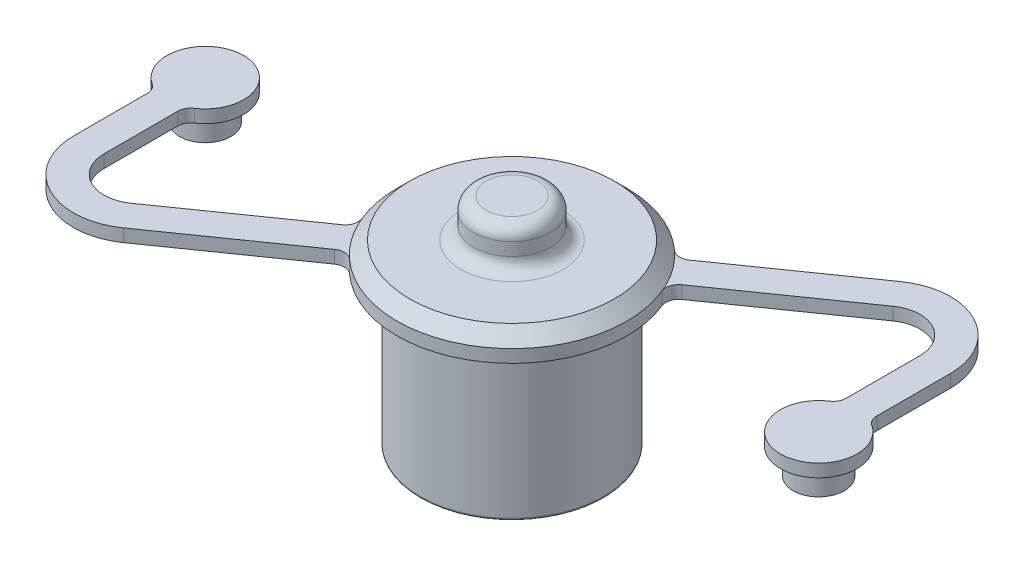
ISO-10303-21;
HEADER;
FILE_DESCRIPTION(('STEP AP214'),'2;1');
FILE_NAME('part.step','',(''),(''),'','','');
FILE_SCHEMA(('AUTOMOTIVE_DESIGN { 1 0 10303 214 1 1 1 1 }'));
ENDSEC;
DATA;
#1=APPLICATION_CONTEXT('core data for automotive mechanical design processes');
#2=APPLICATION_PROTOCOL_DEFINITION('international standard','automotive_design',2000,#1);
#3=PRODUCT_CONTEXT('',#1,'mechanical');
#4=PRODUCT('Part','Part','',(#3));
#5=PRODUCT_RELATED_PRODUCT_CATEGORY('part','',(#4));
#6=PRODUCT_DEFINITION_FORMATION('','',#4);
#7=PRODUCT_DEFINITION_CONTEXT('part definition',#1,'design');
#8=PRODUCT_DEFINITION('design','',#6,#7);
#9=PRODUCT_DEFINITION_SHAPE('','',#8);
#10=(LENGTH_UNIT() NAMED_UNIT(*) SI_UNIT(.MILLI.,.METRE.));
#11=(NAMED_UNIT(*) PLANE_ANGLE_UNIT() SI_UNIT($,.RADIAN.));
#12=(NAMED_UNIT(*) SI_UNIT($,.STERADIAN.) SOLID_ANGLE_UNIT());
#13=UNCERTAINTY_MEASURE_WITH_UNIT(LENGTH_MEASURE(1.E-05),#10,'distance_accuracy_value','');
#14=(GEOMETRIC_REPRESENTATION_CONTEXT(3) GLOBAL_UNCERTAINTY_ASSIGNED_CONTEXT((#13)) GLOBAL_UNIT_ASSIGNED_CONTEXT((#10,
#11,#12)) REPRESENTATION_CONTEXT('',''));
#15=CARTESIAN_POINT('',(0.,0.,0.));
#16=DIRECTION('',(0.,0.,1.));
#17=DIRECTION('',(1.,0.,0.));
#18=AXIS2_PLACEMENT_3D('',#15,#16,#17);
#19=CARTESIAN_POINT('',(0.,1.,0.));
#20=DIRECTION('',(0.,-1.,0.));
#21=DIRECTION('',(0.,0.,-1.));
#22=AXIS2_PLACEMENT_3D('',#19,#20,#21);
#23=CYLINDRICAL_SURFACE('',#22,4.5);
#24=DIRECTION('',(0.,-1.,0.));
#25=VECTOR('',#24,1.);
#26=CARTESIAN_POINT('',(-4.16371288605961,1.,1.70689630688603));
#27=LINE('',#26,#25);
#28=CARTESIAN_POINT('',(-4.16371288605961,0.,1.70689630688603));
#29=VERTEX_POINT('',#28);
#30=CARTESIAN_POINT('',(-4.16371288605961,0.5,1.70689630688603));
#31=VERTEX_POINT('',#30);
#32=EDGE_CURVE('E371',#29,#31,#27,.F.);
#33=ORIENTED_EDGE('',*,*,#32,.T.);
#34=CARTESIAN_POINT('',(0.,0.500000000000002,0.));
#35=DIRECTION('',(0.,1.,0.));
#36=DIRECTION('',(0.,0.,1.));
#37=AXIS2_PLACEMENT_3D('',#34,#35,#36);
#38=CIRCLE('',#37,4.5);
#39=CARTESIAN_POINT('',(3.02803154208453,0.5,-3.32881735457823));
#40=VERTEX_POINT('',#39);
#41=EDGE_CURVE('E395',#31,#40,#38,.F.);
#42=ORIENTED_EDGE('',*,*,#41,.T.);
#43=DIRECTION('',(0.,-1.,0.));
#44=VECTOR('',#43,1.);
#45=CARTESIAN_POINT('',(3.02803154208453,1.,-3.32881735457823));
#46=LINE('',#45,#44);
#47=CARTESIAN_POINT('',(3.02803154208453,0.,-3.32881735457823));
#48=VERTEX_POINT('',#47);
#49=EDGE_CURVE('E327',#40,#48,#46,.T.);
#50=ORIENTED_EDGE('',*,*,#49,.T.);
#51=CARTESIAN_POINT('',(0.,0.,0.));
#52=DIRECTION('',(0.,1.,0.));
#53=DIRECTION('',(0.,0.,1.));
#54=AXIS2_PLACEMENT_3D('',#51,#52,#53);
#55=CIRCLE('',#54,4.5);
#56=EDGE_CURVE('E305',#48,#29,#55,.T.);
#57=ORIENTED_EDGE('',*,*,#56,.T.);
#58=EDGE_LOOP('',(#33,#42,#50,#57));
#59=FACE_BOUND('',#58,.T.);
#60=ADVANCED_FACE('F34',(#59),#23,.T.);
#61=CARTESIAN_POINT('',(-11.4,0.5,4.56052620457425));
#62=DIRECTION('',(-1.,0.,0.));
#63=DIRECTION('',(0.,0.,1.));
#64=AXIS2_PLACEMENT_3D('',#61,#62,#63);
#65=PLANE('',#64);
#66=DIRECTION('',(0.,0.,1.));
#67=VECTOR('',#66,1.);
#68=CARTESIAN_POINT('',(-11.4,0.,4.56052620457425));
#69=LINE('',#68,#67);
#70=CARTESIAN_POINT('',(-11.4,0.,4.56052620457425));
#71=VERTEX_POINT('',#70);
#72=CARTESIAN_POINT('',(-11.4,0.,1.67032930884901));
#73=VERTEX_POINT('',#72);
#74=EDGE_CURVE('E233',#71,#73,#69,.F.);
#75=ORIENTED_EDGE('',*,*,#74,.T.);
#76=DIRECTION('',(0.,1.,0.));
#77=VECTOR('',#76,1.);
#78=CARTESIAN_POINT('',(-11.4,0.5,1.67032930884901));
#79=LINE('',#78,#77);
#80=CARTESIAN_POINT('',(-11.4,0.5,1.67032930884901));
#81=VERTEX_POINT('',#80);
#82=EDGE_CURVE('E361',#73,#81,#79,.T.);
#83=ORIENTED_EDGE('',*,*,#82,.T.);
#84=DIRECTION('',(0.,0.,1.));
#85=VECTOR('',#84,1.);
#86=CARTESIAN_POINT('',(-11.4,0.5,4.56052620457425));
#87=LINE('',#86,#85);
#88=CARTESIAN_POINT('',(-11.4,0.5,4.56052620457425));
#89=VERTEX_POINT('',#88);
#90=EDGE_CURVE('E218',#89,#81,#87,.F.);
#91=ORIENTED_EDGE('',*,*,#90,.F.);
#92=DIRECTION('',(0.,-1.,0.));
#93=VECTOR('',#92,1.);
#94=CARTESIAN_POINT('',(-11.4,0.5,4.56052620457425));
#95=LINE('',#94,#93);
#96=EDGE_CURVE('E232',#89,#71,#95,.T.);
#97=ORIENTED_EDGE('',*,*,#96,.T.);
#98=EDGE_LOOP('',(#75,#83,#91,#97));
#99=FACE_BOUND('',#98,.T.);
#100=ADVANCED_FACE('F424',(#99),#65,.F.);
#101=CARTESIAN_POINT('',(-12.6,0.5,4.56052620457425));
#102=DIRECTION('',(-1.,0.,0.));
#103=DIRECTION('',(0.,0.,1.));
#104=AXIS2_PLACEMENT_3D('',#101,#102,#103);
#105=PLANE('',#104);
#106=DIRECTION('',(0.,0.,1.));
#107=VECTOR('',#106,1.);
#108=CARTESIAN_POINT('',(-12.6,0.5,4.56052620457425));
#109=LINE('',#108,#107);
#110=CARTESIAN_POINT('',(-12.6,0.5,4.56052620457425));
#111=VERTEX_POINT('',#110);
#112=CARTESIAN_POINT('',(-12.6,0.5,1.67032930884901));
#113=VERTEX_POINT('',#112);
#114=EDGE_CURVE('E199',#111,#113,#109,.F.);
#115=ORIENTED_EDGE('',*,*,#114,.T.);
#116=DIRECTION('',(0.,-1.,0.));
#117=VECTOR('',#116,1.);
#118=CARTESIAN_POINT('',(-12.6,0.5,1.67032930884901));
#119=LINE('',#118,#117);
#120=CARTESIAN_POINT('',(-12.6,0.,1.67032930884901));
#121=VERTEX_POINT('',#120);
#122=EDGE_CURVE('E363',#113,#121,#119,.T.);
#123=ORIENTED_EDGE('',*,*,#122,.T.);
#124=DIRECTION('',(0.,0.,1.));
#125=VECTOR('',#124,1.);
#126=CARTESIAN_POINT('',(-12.6,0.,4.56052620457425));
#127=LINE('',#126,#125);
#128=CARTESIAN_POINT('',(-12.6,0.,4.56052620457425));
#129=VERTEX_POINT('',#128);
#130=EDGE_CURVE('E202',#129,#121,#127,.F.);
#131=ORIENTED_EDGE('',*,*,#130,.F.);
#132=DIRECTION('',(0.,-1.,0.));
#133=VECTOR('',#132,1.);
#134=CARTESIAN_POINT('',(-12.6,0.5,4.56052620457425));
#135=LINE('',#134,#133);
#136=EDGE_CURVE('E195',#111,#129,#135,.T.);
#137=ORIENTED_EDGE('',*,*,#136,.F.);
#138=EDGE_LOOP('',(#115,#123,#131,#137));
#139=FACE_BOUND('',#138,.T.);
#140=ADVANCED_FACE('F197',(#139),#105,.T.);
#141=CARTESIAN_POINT('',(11.4,0.5,-4.56052620457425));
#142=DIRECTION('',(1.,0.,0.));
#143=DIRECTION('',(0.,0.,-1.));
#144=AXIS2_PLACEMENT_3D('',#141,#142,#143);
#145=PLANE('',#144);
#146=DIRECTION('',(0.,0.,-1.));
#147=VECTOR('',#146,1.);
#148=CARTESIAN_POINT('',(11.4,0.,-4.56052620457425));
#149=LINE('',#148,#147);
#150=CARTESIAN_POINT('',(11.4,0.,-4.56052620457425));
#151=VERTEX_POINT('',#150);
#152=CARTESIAN_POINT('',(11.4,0.,-1.67032930884901));
#153=VERTEX_POINT('',#152);
#154=EDGE_CURVE('E263',#151,#153,#149,.F.);
#155=ORIENTED_EDGE('',*,*,#154,.T.);
#156=DIRECTION('',(0.,1.,0.));
#157=VECTOR('',#156,1.);
#158=CARTESIAN_POINT('',(11.4,0.5,-1.67032930884901));
#159=LINE('',#158,#157);
#160=CARTESIAN_POINT('',(11.4,0.5,-1.67032930884901));
#161=VERTEX_POINT('',#160);
#162=EDGE_CURVE('E319',#153,#161,#159,.T.);
#163=ORIENTED_EDGE('',*,*,#162,.T.);
#164=DIRECTION('',(0.,0.,-1.));
#165=VECTOR('',#164,1.);
#166=CARTESIAN_POINT('',(11.4,0.5,-4.56052620457425));
#167=LINE('',#166,#165);
#168=CARTESIAN_POINT('',(11.4,0.5,-4.56052620457425));
#169=VERTEX_POINT('',#168);
#170=EDGE_CURVE('E264',#169,#161,#167,.F.);
#171=ORIENTED_EDGE('',*,*,#170,.F.);
#172=DIRECTION('',(0.,-1.,0.));
#173=VECTOR('',#172,1.);
#174=CARTESIAN_POINT('',(11.4,0.5,-4.56052620457425));
#175=LINE('',#174,#173);
#176=EDGE_CURVE('E280',#169,#151,#175,.T.);
#177=ORIENTED_EDGE('',*,*,#176,.T.);
#178=EDGE_LOOP('',(#155,#163,#171,#177));
#179=FACE_BOUND('',#178,.T.);
#180=ADVANCED_FACE('F531',(#179),#145,.F.);
#181=CARTESIAN_POINT('',(12.6,0.5,-4.56052620457425));
#182=DIRECTION('',(1.,0.,0.));
#183=DIRECTION('',(0.,0.,-1.));
#184=AXIS2_PLACEMENT_3D('',#181,#182,#183);
#185=PLANE('',#184);
#186=DIRECTION('',(0.,0.,-1.));
#187=VECTOR('',#186,1.);
#188=CARTESIAN_POINT('',(12.6,0.5,-4.56052620457425));
#189=LINE('',#188,#187);
#190=CARTESIAN_POINT('',(12.6,0.5,-4.56052620457425));
#191=VERTEX_POINT('',#190);
#192=CARTESIAN_POINT('',(12.6,0.5,-1.67032930884901));
#193=VERTEX_POINT('',#192);
#194=EDGE_CURVE('E267',#191,#193,#189,.F.);
#195=ORIENTED_EDGE('',*,*,#194,.T.);
#196=DIRECTION('',(0.,-1.,0.));
#197=VECTOR('',#196,1.);
#198=CARTESIAN_POINT('',(12.6,0.5,-1.67032930884901));
#199=LINE('',#198,#197);
#200=CARTESIAN_POINT('',(12.6,0.,-1.67032930884901));
#201=VERTEX_POINT('',#200);
#202=EDGE_CURVE('E321',#193,#201,#199,.T.);
#203=ORIENTED_EDGE('',*,*,#202,.T.);
#204=DIRECTION('',(0.,0.,-1.));
#205=VECTOR('',#204,1.);
#206=CARTESIAN_POINT('',(12.6,0.,-4.56052620457425));
#207=LINE('',#206,#205);
#208=CARTESIAN_POINT('',(12.6,0.,-4.56052620457425));
#209=VERTEX_POINT('',#208);
#210=EDGE_CURVE('E283',#209,#201,#207,.F.);
#211=ORIENTED_EDGE('',*,*,#210,.F.);
#212=DIRECTION('',(0.,-1.,0.));
#213=VECTOR('',#212,1.);
#214=CARTESIAN_POINT('',(12.6,0.5,-4.56052620457425));
#215=LINE('',#214,#213);
#216=EDGE_CURVE('E302',#191,#209,#215,.T.);
#217=ORIENTED_EDGE('',*,*,#216,.F.);
#218=EDGE_LOOP('',(#195,#203,#211,#217));
#219=FACE_BOUND('',#218,.T.);
#220=ADVANCED_FACE('F447',(#219),#185,.T.);
#221=CARTESIAN_POINT('',(0.,-6.,0.));
#222=DIRECTION('',(0.,1.,0.));
#223=DIRECTION('',(0.,0.,1.));
#224=AXIS2_PLACEMENT_3D('',#221,#222,#223);
#225=CYLINDRICAL_SURFACE('',#224,3.6);
#226=CARTESIAN_POINT('',(0.,-5.88040417379189,0.));
#227=DIRECTION('',(0.,-1.,0.));
#228=DIRECTION('',(0.,0.,-1.));
#229=AXIS2_PLACEMENT_3D('',#226,#227,#228);
#230=CIRCLE('',#229,3.6);
#231=CARTESIAN_POINT('',(0.,-5.88040417379189,-3.6));
#232=VERTEX_POINT('',#231);
#233=EDGE_CURVE('E406',#232,#232,#230,.F.);
#234=ORIENTED_EDGE('',*,*,#233,.T.);
#235=EDGE_LOOP('',(#234));
#236=FACE_BOUND('',#235,.T.);
#237=CARTESIAN_POINT('',(0.,0.,0.));
#238=DIRECTION('',(0.,1.,0.));
#239=DIRECTION('',(0.,0.,1.));
#240=AXIS2_PLACEMENT_3D('',#237,#238,#239);
#241=CIRCLE('',#240,3.6);
#242=CARTESIAN_POINT('',(0.,0.,3.6));
#243=VERTEX_POINT('',#242);
#244=EDGE_CURVE('E308',#243,#243,#241,.T.);
#245=ORIENTED_EDGE('',*,*,#244,.F.);
#246=EDGE_LOOP('',(#245));
#247=FACE_BOUND('',#246,.T.);
#248=ADVANCED_FACE('F437',(#236,#247),#225,.T.);
#249=DIRECTION('',(0.,-1.,0.));
#250=VECTOR('',#249,1.);
#251=CARTESIAN_POINT('',(4.16371288605961,1.,-1.70689630688603));
#252=LINE('',#251,#250);
#253=CARTESIAN_POINT('',(4.16371288605961,0.,-1.70689630688603));
#254=VERTEX_POINT('',#253);
#255=CARTESIAN_POINT('',(4.16371288605961,0.5,-1.70689630688603));
#256=VERTEX_POINT('',#255);
#257=EDGE_CURVE('E330',#254,#256,#252,.F.);
#258=ORIENTED_EDGE('',*,*,#257,.T.);
#259=CARTESIAN_POINT('',(0.,0.500000000000002,0.));
#260=DIRECTION('',(0.,1.,0.));
#261=DIRECTION('',(0.,0.,1.));
#262=AXIS2_PLACEMENT_3D('',#259,#260,#261);
#263=CIRCLE('',#262,4.5);
#264=CARTESIAN_POINT('',(-3.02803154208453,0.5,3.32881735457823));
#265=VERTEX_POINT('',#264);
#266=EDGE_CURVE('E393',#256,#265,#263,.F.);
#267=ORIENTED_EDGE('',*,*,#266,.T.);
#268=DIRECTION('',(0.,-1.,0.));
#269=VECTOR('',#268,1.);
#270=CARTESIAN_POINT('',(-3.02803154208453,1.,3.32881735457823));
#271=LINE('',#270,#269);
#272=CARTESIAN_POINT('',(-3.02803154208453,0.,3.32881735457823));
#273=VERTEX_POINT('',#272);
#274=EDGE_CURVE('E368',#265,#273,#271,.T.);
#275=ORIENTED_EDGE('',*,*,#274,.T.);
#276=EDGE_CURVE('E304',#273,#254,#55,.T.);
#277=ORIENTED_EDGE('',*,*,#276,.T.);
#278=EDGE_LOOP('',(#258,#267,#275,#277));
#279=FACE_BOUND('',#278,.T.);
#280=ADVANCED_FACE('F427',(#279),#23,.T.);
#281=CARTESIAN_POINT('',(0.,1.,0.));
#282=DIRECTION('',(0.,1.,0.));
#283=DIRECTION('',(0.,0.,1.));
#284=AXIS2_PLACEMENT_3D('',#281,#282,#283);
#285=PLANE('',#284);
#286=CARTESIAN_POINT('',(0.,1.,0.));
#287=DIRECTION('',(0.,1.,0.));
#288=DIRECTION('',(0.,0.,1.));
#289=AXIS2_PLACEMENT_3D('',#286,#287,#288);
#290=CIRCLE('',#289,2.);
#291=CARTESIAN_POINT('',(0.,1.,2.));
#292=VERTEX_POINT('',#291);
#293=EDGE_CURVE('E11',#292,#292,#290,.F.);
#294=ORIENTED_EDGE('',*,*,#293,.T.);
#295=EDGE_LOOP('',(#294));
#296=FACE_BOUND('',#295,.T.);
#297=CARTESIAN_POINT('',(0.,1.,0.));
#298=DIRECTION('',(0.,1.,0.));
#299=DIRECTION('',(0.,0.,1.));
#300=AXIS2_PLACEMENT_3D('',#297,#298,#299);
#301=CIRCLE('',#300,4.);
#302=CARTESIAN_POINT('',(0.,1.,4.));
#303=VERTEX_POINT('',#302);
#304=EDGE_CURVE('E390',#303,#303,#301,.T.);
#305=ORIENTED_EDGE('',*,*,#304,.T.);
#306=EDGE_LOOP('',(#305));
#307=FACE_BOUND('',#306,.T.);
#308=ADVANCED_FACE('F436',(#296,#307),#285,.T.);
#309=CARTESIAN_POINT('',(0.,0.,0.));
#310=DIRECTION('',(0.,1.,0.));
#311=DIRECTION('',(0.,0.,1.));
#312=AXIS2_PLACEMENT_3D('',#309,#310,#311);
#313=PLANE('',#312);
#314=CARTESIAN_POINT('',(-12.,0.,0.));
#315=DIRECTION('',(0.,1.,0.));
#316=DIRECTION('',(0.,0.,-1.));
#317=AXIS2_PLACEMENT_3D('',#314,#315,#316);
#318=CIRCLE('',#317,1.);
#319=CARTESIAN_POINT('',(-12.,0.,-0.999999999999999));
#320=VERTEX_POINT('',#319);
#321=EDGE_CURVE('E490',#320,#320,#318,.T.);
#322=ORIENTED_EDGE('',*,*,#321,.T.);
#323=EDGE_LOOP('',(#322));
#324=FACE_BOUND('',#323,.T.);
#325=ORIENTED_EDGE('',*,*,#130,.T.);
#326=CARTESIAN_POINT('',(-13.1,0.,1.67032930884901));
#327=DIRECTION('',(0.,1.,0.));
#328=DIRECTION('',(0.,0.,1.));
#329=AXIS2_PLACEMENT_3D('',#326,#327,#328);
#330=CIRCLE('',#329,0.5);
#331=CARTESIAN_POINT('',(-12.825,0.,1.25274698163676));
#332=VERTEX_POINT('',#331);
#333=EDGE_CURVE('E379',#121,#332,#330,.T.);
#334=ORIENTED_EDGE('',*,*,#333,.T.);
#335=CARTESIAN_POINT('',(-12.,0.,0.));
#336=DIRECTION('',(0.,1.,0.));
#337=DIRECTION('',(0.,0.,-1.));
#338=AXIS2_PLACEMENT_3D('',#335,#336,#337);
#339=CIRCLE('',#338,1.5);
#340=CARTESIAN_POINT('',(-11.175,0.,1.25274698163676));
#341=VERTEX_POINT('',#340);
#342=EDGE_CURVE('E486',#341,#332,#339,.T.);
#343=ORIENTED_EDGE('',*,*,#342,.F.);
#344=CARTESIAN_POINT('',(-10.9,0.,1.67032930884901));
#345=DIRECTION('',(0.,1.,0.));
#346=DIRECTION('',(0.,0.,1.));
#347=AXIS2_PLACEMENT_3D('',#344,#345,#346);
#348=CIRCLE('',#347,0.5);
#349=EDGE_CURVE('E375',#341,#73,#348,.T.);
#350=ORIENTED_EDGE('',*,*,#349,.T.);
#351=ORIENTED_EDGE('',*,*,#74,.F.);
#352=CARTESIAN_POINT('',(-10.,0.,4.56052620457425));
#353=DIRECTION('',(0.,1.,0.));
#354=DIRECTION('',(-1.,0.,0.));
#355=AXIS2_PLACEMENT_3D('',#352,#353,#354);
#356=CIRCLE('',#355,1.4);
#357=CARTESIAN_POINT('',(-9.19699298910853,0.,5.70733906657884));
#358=VERTEX_POINT('',#357);
#359=EDGE_CURVE('E244',#358,#71,#356,.F.);
#360=ORIENTED_EDGE('',*,*,#359,.F.);
#361=DIRECTION('',(-0.819152044288989,0.,0.57357643635105));
#362=VECTOR('',#361,1.);
#363=CARTESIAN_POINT('',(-0.34414586181063,0.,-0.491491226573393));
#364=LINE('',#363,#362);
#365=CARTESIAN_POINT('',(-4.33955943300182,0.,2.30612747424008));
#366=VERTEX_POINT('',#365);
#367=EDGE_CURVE('E242',#366,#358,#364,.T.);
#368=ORIENTED_EDGE('',*,*,#367,.F.);
#369=CARTESIAN_POINT('',(-4.62634765117734,0.,1.89655145209559));
#370=DIRECTION('',(0.,1.,0.));
#371=DIRECTION('',(0.,0.,1.));
#372=AXIS2_PLACEMENT_3D('',#369,#370,#371);
#373=CIRCLE('',#372,0.5);
#374=EDGE_CURVE('E382',#366,#29,#373,.T.);
#375=ORIENTED_EDGE('',*,*,#374,.T.);
#376=ORIENTED_EDGE('',*,*,#56,.F.);
#377=CARTESIAN_POINT('',(3.36447949120503,0.,-3.69868594953136));
#378=DIRECTION('',(0.,1.,0.));
#379=DIRECTION('',(0.,0.,1.));
#380=AXIS2_PLACEMENT_3D('',#377,#378,#379);
#381=CIRCLE('',#380,0.5);
#382=CARTESIAN_POINT('',(3.65126770938056,0.,-3.28910992738687));
#383=VERTEX_POINT('',#382);
#384=EDGE_CURVE('E348',#48,#383,#381,.T.);
#385=ORIENTED_EDGE('',*,*,#384,.T.);
#386=DIRECTION('',(0.819152044288989,0.,-0.57357643635105));
#387=VECTOR('',#386,1.);
#388=CARTESIAN_POINT('',(-0.34414586181063,0.,-0.491491226573393));
#389=LINE('',#388,#387);
#390=CARTESIAN_POINT('',(8.50870126548727,0.,-6.69032151972562));
#391=VERTEX_POINT('',#390);
#392=EDGE_CURVE('E289',#383,#391,#389,.T.);
#393=ORIENTED_EDGE('',*,*,#392,.T.);
#394=CARTESIAN_POINT('',(10.,0.,-4.56052620457425));
#395=DIRECTION('',(0.,1.,0.));
#396=DIRECTION('',(1.,0.,0.));
#397=AXIS2_PLACEMENT_3D('',#394,#395,#396);
#398=CIRCLE('',#397,2.6);
#399=EDGE_CURVE('E286',#391,#209,#398,.F.);
#400=ORIENTED_EDGE('',*,*,#399,.T.);
#401=ORIENTED_EDGE('',*,*,#210,.T.);
#402=CARTESIAN_POINT('',(13.1,0.,-1.67032930884901));
#403=DIRECTION('',(0.,1.,0.));
#404=DIRECTION('',(0.,0.,1.));
#405=AXIS2_PLACEMENT_3D('',#402,#403,#404);
#406=CIRCLE('',#405,0.5);
#407=CARTESIAN_POINT('',(12.825,0.,-1.25274698163676));
#408=VERTEX_POINT('',#407);
#409=EDGE_CURVE('E339',#201,#408,#406,.T.);
#410=ORIENTED_EDGE('',*,*,#409,.T.);
#411=CARTESIAN_POINT('',(12.,0.,0.));
#412=DIRECTION('',(0.,1.,0.));
#413=DIRECTION('',(0.,0.,1.));
#414=AXIS2_PLACEMENT_3D('',#411,#412,#413);
#415=CIRCLE('',#414,1.5);
#416=CARTESIAN_POINT('',(11.175,0.,-1.25274698163676));
#417=VERTEX_POINT('',#416);
#418=EDGE_CURVE('E255',#417,#408,#415,.T.);
#419=ORIENTED_EDGE('',*,*,#418,.F.);
#420=CARTESIAN_POINT('',(10.9,0.,-1.67032930884901));
#421=DIRECTION('',(0.,1.,0.));
#422=DIRECTION('',(0.,0.,1.));
#423=AXIS2_PLACEMENT_3D('',#420,#421,#422);
#424=CIRCLE('',#423,0.5);
#425=EDGE_CURVE('E335',#417,#153,#424,.T.);
#426=ORIENTED_EDGE('',*,*,#425,.T.);
#427=ORIENTED_EDGE('',*,*,#154,.F.);
#428=CARTESIAN_POINT('',(10.,0.,-4.56052620457425));
#429=DIRECTION('',(0.,1.,0.));
#430=DIRECTION('',(1.,0.,0.));
#431=AXIS2_PLACEMENT_3D('',#428,#429,#430);
#432=CIRCLE('',#431,1.4);
#433=CARTESIAN_POINT('',(9.19699298910853,0.,-5.70733906657884));
#434=VERTEX_POINT('',#433);
#435=EDGE_CURVE('E268',#434,#151,#432,.F.);
#436=ORIENTED_EDGE('',*,*,#435,.F.);
#437=DIRECTION('',(0.819152044288989,0.,-0.57357643635105));
#438=VECTOR('',#437,1.);
#439=CARTESIAN_POINT('',(0.34414586181063,0.,0.491491226573393));
#440=LINE('',#439,#438);
#441=CARTESIAN_POINT('',(4.33955943300182,0.,-2.30612747424008));
#442=VERTEX_POINT('',#441);
#443=EDGE_CURVE('E291',#442,#434,#440,.T.);
#444=ORIENTED_EDGE('',*,*,#443,.F.);
#445=CARTESIAN_POINT('',(4.62634765117734,0.,-1.89655145209559));
#446=DIRECTION('',(0.,1.,0.));
#447=DIRECTION('',(0.,0.,1.));
#448=AXIS2_PLACEMENT_3D('',#445,#446,#447);
#449=CIRCLE('',#448,0.5);
#450=EDGE_CURVE('E343',#442,#254,#449,.T.);
#451=ORIENTED_EDGE('',*,*,#450,.T.);
#452=ORIENTED_EDGE('',*,*,#276,.F.);
#453=CARTESIAN_POINT('',(-3.36447949120503,0.,3.69868594953136));
#454=DIRECTION('',(0.,1.,0.));
#455=DIRECTION('',(0.,0.,1.));
#456=AXIS2_PLACEMENT_3D('',#453,#454,#455);
#457=CIRCLE('',#456,0.5);
#458=CARTESIAN_POINT('',(-3.65126770938056,0.,3.28910992738687));
#459=VERTEX_POINT('',#458);
#460=EDGE_CURVE('E49',#273,#459,#457,.T.);
#461=ORIENTED_EDGE('',*,*,#460,.T.);
#462=DIRECTION('',(-0.819152044288989,0.,0.57357643635105));
#463=VECTOR('',#462,1.);
#464=CARTESIAN_POINT('',(0.34414586181063,0.,0.491491226573393));
#465=LINE('',#464,#463);
#466=CARTESIAN_POINT('',(-8.50870126548727,0.,6.69032151972562));
#467=VERTEX_POINT('',#466);
#468=EDGE_CURVE('E240',#459,#467,#465,.T.);
#469=ORIENTED_EDGE('',*,*,#468,.T.);
#470=CARTESIAN_POINT('',(-10.,0.,4.56052620457425));
#471=DIRECTION('',(0.,1.,0.));
#472=DIRECTION('',(-1.,0.,0.));
#473=AXIS2_PLACEMENT_3D('',#470,#471,#472);
#474=CIRCLE('',#473,2.6);
#475=EDGE_CURVE('E238',#467,#129,#474,.F.);
#476=ORIENTED_EDGE('',*,*,#475,.T.);
#477=EDGE_LOOP('',(#325,#334,#343,#350,#351,#360,#368,#375,#376,#385,#393,#400,#401,#410,#419,
#426,#427,#436,#444,#451,#452,#461,#469,#476));
#478=FACE_BOUND('',#477,.T.);
#479=ORIENTED_EDGE('',*,*,#244,.T.);
#480=EDGE_LOOP('',(#479));
#481=FACE_BOUND('',#480,.T.);
#482=CARTESIAN_POINT('',(12.,0.,0.));
#483=DIRECTION('',(0.,1.,0.));
#484=DIRECTION('',(0.,0.,1.));
#485=AXIS2_PLACEMENT_3D('',#482,#483,#484);
#486=CIRCLE('',#485,1.);
#487=CARTESIAN_POINT('',(12.,0.,0.999999999999999));
#488=VERTEX_POINT('',#487);
#489=EDGE_CURVE('E207',#488,#488,#486,.T.);
#490=ORIENTED_EDGE('',*,*,#489,.T.);
#491=EDGE_LOOP('',(#490));
#492=FACE_BOUND('',#491,.T.);
#493=ADVANCED_FACE('F444',(#324,#478,#481,#492),#313,.F.);
#494=CARTESIAN_POINT('',(-0.34414586181063,0.5,-0.491491226573393));
#495=DIRECTION('',(-0.57357643635105,0.,-0.819152044288989));
#496=DIRECTION('',(-0.819152044288989,0.,0.57357643635105));
#497=AXIS2_PLACEMENT_3D('',#494,#495,#496);
#498=PLANE('',#497);
#499=ORIENTED_EDGE('',*,*,#392,.F.);
#500=DIRECTION('',(0.,-1.,0.));
#501=VECTOR('',#500,1.);
#502=CARTESIAN_POINT('',(3.65126770938056,0.5,-3.28910992738687));
#503=LINE('',#502,#501);
#504=CARTESIAN_POINT('',(3.65126770938056,0.5,-3.28910992738687));
#505=VERTEX_POINT('',#504);
#506=EDGE_CURVE('E333',#383,#505,#503,.F.);
#507=ORIENTED_EDGE('',*,*,#506,.T.);
#508=DIRECTION('',(0.819152044288989,0.,-0.57357643635105));
#509=VECTOR('',#508,1.);
#510=CARTESIAN_POINT('',(-0.34414586181063,0.5,-0.491491226573393));
#511=LINE('',#510,#509);
#512=CARTESIAN_POINT('',(8.50870126548727,0.5,-6.69032151972562));
#513=VERTEX_POINT('',#512);
#514=EDGE_CURVE('E274',#505,#513,#511,.T.);
#515=ORIENTED_EDGE('',*,*,#514,.T.);
#516=DIRECTION('',(0.,-1.,0.));
#517=VECTOR('',#516,1.);
#518=CARTESIAN_POINT('',(8.50870126548727,0.5,-6.69032151972562));
#519=LINE('',#518,#517);
#520=EDGE_CURVE('E299',#513,#391,#519,.T.);
#521=ORIENTED_EDGE('',*,*,#520,.T.);
#522=EDGE_LOOP('',(#499,#507,#515,#521));
#523=FACE_BOUND('',#522,.T.);
#524=ADVANCED_FACE('F557',(#523),#498,.T.);
#525=CARTESIAN_POINT('',(0.34414586181063,0.5,0.491491226573393));
#526=DIRECTION('',(-0.57357643635105,0.,-0.819152044288989));
#527=DIRECTION('',(-0.819152044288989,0.,0.57357643635105));
#528=AXIS2_PLACEMENT_3D('',#525,#526,#527);
#529=PLANE('',#528);
#530=DIRECTION('',(0.819152044288989,0.,-0.57357643635105));
#531=VECTOR('',#530,1.);
#532=CARTESIAN_POINT('',(0.34414586181063,0.5,0.491491226573393));
#533=LINE('',#532,#531);
#534=CARTESIAN_POINT('',(4.33955943300182,0.5,-2.30612747424008));
#535=VERTEX_POINT('',#534);
#536=CARTESIAN_POINT('',(9.19699298910853,0.5,-5.70733906657884));
#537=VERTEX_POINT('',#536);
#538=EDGE_CURVE('E276',#535,#537,#533,.T.);
#539=ORIENTED_EDGE('',*,*,#538,.F.);
#540=DIRECTION('',(0.,1.,0.));
#541=VECTOR('',#540,1.);
#542=CARTESIAN_POINT('',(4.33955943300182,0.,-2.30612747424008));
#543=LINE('',#542,#541);
#544=EDGE_CURVE('E324',#535,#442,#543,.F.);
#545=ORIENTED_EDGE('',*,*,#544,.T.);
#546=ORIENTED_EDGE('',*,*,#443,.T.);
#547=DIRECTION('',(0.,-1.,0.));
#548=VECTOR('',#547,1.);
#549=CARTESIAN_POINT('',(9.19699298910853,0.5,-5.70733906657884));
#550=LINE('',#549,#548);
#551=EDGE_CURVE('E296',#537,#434,#550,.T.);
#552=ORIENTED_EDGE('',*,*,#551,.F.);
#553=EDGE_LOOP('',(#539,#545,#546,#552));
#554=FACE_BOUND('',#553,.T.);
#555=ADVANCED_FACE('F554',(#554),#529,.F.);
#556=CARTESIAN_POINT('',(10.,0.5,-4.56052620457425));
#557=DIRECTION('',(0.,-1.,0.));
#558=DIRECTION('',(0.,0.,-1.));
#559=AXIS2_PLACEMENT_3D('',#556,#557,#558);
#560=CYLINDRICAL_SURFACE('',#559,2.6);
#561=ORIENTED_EDGE('',*,*,#399,.F.);
#562=ORIENTED_EDGE('',*,*,#520,.F.);
#563=CARTESIAN_POINT('',(10.,0.5,-4.56052620457425));
#564=DIRECTION('',(0.,1.,0.));
#565=DIRECTION('',(1.,0.,0.));
#566=AXIS2_PLACEMENT_3D('',#563,#564,#565);
#567=CIRCLE('',#566,2.6);
#568=EDGE_CURVE('E271',#513,#191,#567,.F.);
#569=ORIENTED_EDGE('',*,*,#568,.T.);
#570=ORIENTED_EDGE('',*,*,#216,.T.);
#571=EDGE_LOOP('',(#561,#562,#569,#570));
#572=FACE_BOUND('',#571,.T.);
#573=ADVANCED_FACE('F552',(#572),#560,.T.);
#574=CARTESIAN_POINT('',(10.,0.5,-4.56052620457425));
#575=DIRECTION('',(0.,-1.,0.));
#576=DIRECTION('',(0.,0.,-1.));
#577=AXIS2_PLACEMENT_3D('',#574,#575,#576);
#578=CYLINDRICAL_SURFACE('',#577,1.4);
#579=ORIENTED_EDGE('',*,*,#435,.T.);
#580=ORIENTED_EDGE('',*,*,#176,.F.);
#581=CARTESIAN_POINT('',(10.,0.5,-4.56052620457425));
#582=DIRECTION('',(0.,1.,0.));
#583=DIRECTION('',(1.,0.,0.));
#584=AXIS2_PLACEMENT_3D('',#581,#582,#583);
#585=CIRCLE('',#584,1.4);
#586=EDGE_CURVE('E278',#537,#169,#585,.F.);
#587=ORIENTED_EDGE('',*,*,#586,.F.);
#588=ORIENTED_EDGE('',*,*,#551,.T.);
#589=EDGE_LOOP('',(#579,#580,#587,#588));
#590=FACE_BOUND('',#589,.T.);
#591=ADVANCED_FACE('F549',(#590),#578,.F.);
#592=CARTESIAN_POINT('',(10.,0.5,-4.56052620457425));
#593=DIRECTION('',(0.,1.,0.));
#594=DIRECTION('',(1.,0.,0.));
#595=AXIS2_PLACEMENT_3D('',#592,#593,#594);
#596=PLANE('',#595);
#597=ORIENTED_EDGE('',*,*,#170,.T.);
#598=CARTESIAN_POINT('',(10.9,0.5,-1.67032930884901));
#599=DIRECTION('',(0.,1.,0.));
#600=DIRECTION('',(0.,0.,1.));
#601=AXIS2_PLACEMENT_3D('',#598,#599,#600);
#602=CIRCLE('',#601,0.5);
#603=CARTESIAN_POINT('',(11.175,0.5,-1.25274698163676));
#604=VERTEX_POINT('',#603);
#605=EDGE_CURVE('E337',#161,#604,#602,.F.);
#606=ORIENTED_EDGE('',*,*,#605,.T.);
#607=CARTESIAN_POINT('',(12.,0.5,0.));
#608=DIRECTION('',(0.,1.,0.));
#609=DIRECTION('',(0.,0.,1.));
#610=AXIS2_PLACEMENT_3D('',#607,#608,#609);
#611=CIRCLE('',#610,1.5);
#612=CARTESIAN_POINT('',(12.825,0.5,-1.25274698163676));
#613=VERTEX_POINT('',#612);
#614=EDGE_CURVE('E260',#604,#613,#611,.T.);
#615=ORIENTED_EDGE('',*,*,#614,.T.);
#616=CARTESIAN_POINT('',(13.1,0.5,-1.67032930884901));
#617=DIRECTION('',(0.,1.,0.));
#618=DIRECTION('',(0.,0.,1.));
#619=AXIS2_PLACEMENT_3D('',#616,#617,#618);
#620=CIRCLE('',#619,0.5);
#621=EDGE_CURVE('E341',#613,#193,#620,.F.);
#622=ORIENTED_EDGE('',*,*,#621,.T.);
#623=ORIENTED_EDGE('',*,*,#194,.F.);
#624=ORIENTED_EDGE('',*,*,#568,.F.);
#625=ORIENTED_EDGE('',*,*,#514,.F.);
#626=CARTESIAN_POINT('',(3.36447949120503,0.5,-3.69868594953136));
#627=DIRECTION('',(0.,1.,0.));
#628=DIRECTION('',(0.,0.,1.));
#629=AXIS2_PLACEMENT_3D('',#626,#627,#628);
#630=CIRCLE('',#629,0.5);
#631=EDGE_CURVE('E350',#505,#40,#630,.F.);
#632=ORIENTED_EDGE('',*,*,#631,.T.);
#633=CARTESIAN_POINT('',(0.,0.5,0.));
#634=DIRECTION('',(0.,1.,0.));
#635=DIRECTION('',(0.,0.,1.));
#636=AXIS2_PLACEMENT_3D('',#633,#634,#635);
#637=CIRCLE('',#636,4.5);
#638=EDGE_CURVE('E311',#256,#40,#637,.T.);
#639=ORIENTED_EDGE('',*,*,#638,.F.);
#640=CARTESIAN_POINT('',(4.62634765117734,0.5,-1.89655145209559));
#641=DIRECTION('',(0.,1.,0.));
#642=DIRECTION('',(0.,0.,1.));
#643=AXIS2_PLACEMENT_3D('',#640,#641,#642);
#644=CIRCLE('',#643,0.5);
#645=EDGE_CURVE('E346',#256,#535,#644,.F.);
#646=ORIENTED_EDGE('',*,*,#645,.T.);
#647=ORIENTED_EDGE('',*,*,#538,.T.);
#648=ORIENTED_EDGE('',*,*,#586,.T.);
#649=EDGE_LOOP('',(#597,#606,#615,#622,#623,#624,#625,#632,#639,#646,#647,#648));
#650=FACE_BOUND('',#649,.T.);
#651=ADVANCED_FACE('F545',(#650),#596,.T.);
#652=CARTESIAN_POINT('',(12.,4.74264068711929,0.));
#653=DIRECTION('',(0.,-1.,0.));
#654=DIRECTION('',(0.,0.,-1.));
#655=AXIS2_PLACEMENT_3D('',#652,#653,#654);
#656=CYLINDRICAL_SURFACE('',#655,1.5);
#657=ORIENTED_EDGE('',*,*,#614,.F.);
#658=DIRECTION('',(0.,-1.,0.));
#659=VECTOR('',#658,1.);
#660=CARTESIAN_POINT('',(11.175,4.74264068711929,-1.25274698163676));
#661=LINE('',#660,#659);
#662=EDGE_CURVE('E316',#604,#417,#661,.T.);
#663=ORIENTED_EDGE('',*,*,#662,.T.);
#664=ORIENTED_EDGE('',*,*,#418,.T.);
#665=DIRECTION('',(0.,-1.,0.));
#666=VECTOR('',#665,1.);
#667=CARTESIAN_POINT('',(12.825,4.74264068711929,-1.25274698163676));
#668=LINE('',#667,#666);
#669=EDGE_CURVE('E314',#408,#613,#668,.F.);
#670=ORIENTED_EDGE('',*,*,#669,.T.);
#671=EDGE_LOOP('',(#657,#663,#664,#670));
#672=FACE_BOUND('',#671,.T.);
#673=ADVANCED_FACE('F541',(#672),#656,.T.);
#674=CARTESIAN_POINT('',(12.,-1.,0.));
#675=DIRECTION('',(0.,1.,0.));
#676=DIRECTION('',(0.,0.,1.));
#677=AXIS2_PLACEMENT_3D('',#674,#675,#676);
#678=CYLINDRICAL_SURFACE('',#677,1.);
#679=CARTESIAN_POINT('',(12.,-1.,0.));
#680=DIRECTION('',(0.,1.,0.));
#681=DIRECTION('',(0.,0.,1.));
#682=AXIS2_PLACEMENT_3D('',#679,#680,#681);
#683=CIRCLE('',#682,1.);
#684=CARTESIAN_POINT('',(12.,-1.,0.999999999999999));
#685=VERTEX_POINT('',#684);
#686=EDGE_CURVE('E252',#685,#685,#683,.T.);
#687=ORIENTED_EDGE('',*,*,#686,.T.);
#688=EDGE_LOOP('',(#687));
#689=FACE_BOUND('',#688,.T.);
#690=ORIENTED_EDGE('',*,*,#489,.F.);
#691=EDGE_LOOP('',(#690));
#692=FACE_BOUND('',#691,.T.);
#693=ADVANCED_FACE('F537',(#689,#692),#678,.T.);
#694=CARTESIAN_POINT('',(12.,-1.,0.));
#695=DIRECTION('',(0.,1.,0.));
#696=DIRECTION('',(0.,0.,1.));
#697=AXIS2_PLACEMENT_3D('',#694,#695,#696);
#698=PLANE('',#697);
#699=ORIENTED_EDGE('',*,*,#686,.F.);
#700=EDGE_LOOP('',(#699));
#701=FACE_BOUND('',#700,.T.);
#702=ADVANCED_FACE('F533',(#701),#698,.F.);
#703=CARTESIAN_POINT('',(10.9,4.74264068711929,-1.67032930884901));
#704=DIRECTION('',(0.,-1.,0.));
#705=DIRECTION('',(0.,0.,-1.));
#706=AXIS2_PLACEMENT_3D('',#703,#704,#705);
#707=CYLINDRICAL_SURFACE('',#706,0.5);
#708=ORIENTED_EDGE('',*,*,#605,.F.);
#709=ORIENTED_EDGE('',*,*,#162,.F.);
#710=ORIENTED_EDGE('',*,*,#425,.F.);
#711=ORIENTED_EDGE('',*,*,#662,.F.);
#712=EDGE_LOOP('',(#708,#709,#710,#711));
#713=FACE_BOUND('',#712,.T.);
#714=ADVANCED_FACE('F536',(#713),#707,.F.);
#715=CARTESIAN_POINT('',(13.1,4.74264068711929,-1.67032930884901));
#716=DIRECTION('',(0.,-1.,0.));
#717=DIRECTION('',(0.,0.,-1.));
#718=AXIS2_PLACEMENT_3D('',#715,#716,#717);
#719=CYLINDRICAL_SURFACE('',#718,0.5);
#720=ORIENTED_EDGE('',*,*,#621,.F.);
#721=ORIENTED_EDGE('',*,*,#669,.F.);
#722=ORIENTED_EDGE('',*,*,#409,.F.);
#723=ORIENTED_EDGE('',*,*,#202,.F.);
#724=EDGE_LOOP('',(#720,#721,#722,#723));
#725=FACE_BOUND('',#724,.T.);
#726=ADVANCED_FACE('F620',(#725),#719,.F.);
#727=CARTESIAN_POINT('',(4.62634765117734,1.,-1.89655145209559));
#728=DIRECTION('',(0.,-1.,0.));
#729=DIRECTION('',(0.,0.,-1.));
#730=AXIS2_PLACEMENT_3D('',#727,#728,#729);
#731=CYLINDRICAL_SURFACE('',#730,0.5);
#732=ORIENTED_EDGE('',*,*,#645,.F.);
#733=ORIENTED_EDGE('',*,*,#257,.F.);
#734=ORIENTED_EDGE('',*,*,#450,.F.);
#735=ORIENTED_EDGE('',*,*,#544,.F.);
#736=EDGE_LOOP('',(#732,#733,#734,#735));
#737=FACE_BOUND('',#736,.T.);
#738=ADVANCED_FACE('F454',(#737),#731,.F.);
#739=CARTESIAN_POINT('',(3.36447949120503,1.,-3.69868594953136));
#740=DIRECTION('',(0.,-1.,0.));
#741=DIRECTION('',(0.,0.,-1.));
#742=AXIS2_PLACEMENT_3D('',#739,#740,#741);
#743=CYLINDRICAL_SURFACE('',#742,0.5);
#744=ORIENTED_EDGE('',*,*,#631,.F.);
#745=ORIENTED_EDGE('',*,*,#506,.F.);
#746=ORIENTED_EDGE('',*,*,#384,.F.);
#747=ORIENTED_EDGE('',*,*,#49,.F.);
#748=EDGE_LOOP('',(#744,#745,#746,#747));
#749=FACE_BOUND('',#748,.T.);
#750=ADVANCED_FACE('F527',(#749),#743,.F.);
#751=CARTESIAN_POINT('',(0.34414586181063,0.5,0.491491226573393));
#752=DIRECTION('',(0.57357643635105,0.,0.819152044288989));
#753=DIRECTION('',(0.819152044288989,0.,-0.57357643635105));
#754=AXIS2_PLACEMENT_3D('',#751,#752,#753);
#755=PLANE('',#754);
#756=ORIENTED_EDGE('',*,*,#468,.F.);
#757=DIRECTION('',(0.,-1.,0.));
#758=VECTOR('',#757,1.);
#759=CARTESIAN_POINT('',(-3.65126770938056,0.5,3.28910992738687));
#760=LINE('',#759,#758);
#761=CARTESIAN_POINT('',(-3.65126770938056,0.5,3.28910992738687));
#762=VERTEX_POINT('',#761);
#763=EDGE_CURVE('E56',#459,#762,#760,.F.);
#764=ORIENTED_EDGE('',*,*,#763,.T.);
#765=DIRECTION('',(-0.819152044288989,0.,0.57357643635105));
#766=VECTOR('',#765,1.);
#767=CARTESIAN_POINT('',(0.34414586181063,0.5,0.491491226573393));
#768=LINE('',#767,#766);
#769=CARTESIAN_POINT('',(-8.50870126548727,0.5,6.69032151972562));
#770=VERTEX_POINT('',#769);
#771=EDGE_CURVE('E223',#762,#770,#768,.T.);
#772=ORIENTED_EDGE('',*,*,#771,.T.);
#773=DIRECTION('',(0.,-1.,0.));
#774=VECTOR('',#773,1.);
#775=CARTESIAN_POINT('',(-8.50870126548727,0.5,6.69032151972562));
#776=LINE('',#775,#774);
#777=EDGE_CURVE('E208',#770,#467,#776,.T.);
#778=ORIENTED_EDGE('',*,*,#777,.T.);
#779=EDGE_LOOP('',(#756,#764,#772,#778));
#780=FACE_BOUND('',#779,.T.);
#781=ADVANCED_FACE('F524',(#780),#755,.T.);
#782=CARTESIAN_POINT('',(-0.34414586181063,0.5,-0.491491226573393));
#783=DIRECTION('',(0.57357643635105,0.,0.819152044288989));
#784=DIRECTION('',(0.819152044288989,0.,-0.57357643635105));
#785=AXIS2_PLACEMENT_3D('',#782,#783,#784);
#786=PLANE('',#785);
#787=DIRECTION('',(-0.819152044288989,0.,0.57357643635105));
#788=VECTOR('',#787,1.);
#789=CARTESIAN_POINT('',(-0.34414586181063,0.5,-0.491491226573393));
#790=LINE('',#789,#788);
#791=CARTESIAN_POINT('',(-4.33955943300182,0.5,2.30612747424008));
#792=VERTEX_POINT('',#791);
#793=CARTESIAN_POINT('',(-9.19699298910853,0.5,5.70733906657884));
#794=VERTEX_POINT('',#793);
#795=EDGE_CURVE('E225',#792,#794,#790,.T.);
#796=ORIENTED_EDGE('',*,*,#795,.F.);
#797=DIRECTION('',(0.,1.,0.));
#798=VECTOR('',#797,1.);
#799=CARTESIAN_POINT('',(-4.33955943300182,0.,2.30612747424008));
#800=LINE('',#799,#798);
#801=EDGE_CURVE('E365',#792,#366,#800,.F.);
#802=ORIENTED_EDGE('',*,*,#801,.T.);
#803=ORIENTED_EDGE('',*,*,#367,.T.);
#804=DIRECTION('',(0.,-1.,0.));
#805=VECTOR('',#804,1.);
#806=CARTESIAN_POINT('',(-9.19699298910853,0.5,5.70733906657884));
#807=LINE('',#806,#805);
#808=EDGE_CURVE('E248',#794,#358,#807,.T.);
#809=ORIENTED_EDGE('',*,*,#808,.F.);
#810=EDGE_LOOP('',(#796,#802,#803,#809));
#811=FACE_BOUND('',#810,.T.);
#812=ADVANCED_FACE('F472',(#811),#786,.F.);
#813=CARTESIAN_POINT('',(-10.,0.5,4.56052620457425));
#814=DIRECTION('',(0.,-1.,0.));
#815=DIRECTION('',(0.,0.,-1.));
#816=AXIS2_PLACEMENT_3D('',#813,#814,#815);
#817=CYLINDRICAL_SURFACE('',#816,2.6);
#818=ORIENTED_EDGE('',*,*,#475,.F.);
#819=ORIENTED_EDGE('',*,*,#777,.F.);
#820=CARTESIAN_POINT('',(-10.,0.5,4.56052620457425));
#821=DIRECTION('',(0.,1.,0.));
#822=DIRECTION('',(-1.,0.,0.));
#823=AXIS2_PLACEMENT_3D('',#820,#821,#822);
#824=CIRCLE('',#823,2.6);
#825=EDGE_CURVE('E214',#770,#111,#824,.F.);
#826=ORIENTED_EDGE('',*,*,#825,.T.);
#827=ORIENTED_EDGE('',*,*,#136,.T.);
#828=EDGE_LOOP('',(#818,#819,#826,#827));
#829=FACE_BOUND('',#828,.T.);
#830=ADVANCED_FACE('F221',(#829),#817,.T.);
#831=CARTESIAN_POINT('',(-10.,0.5,4.56052620457425));
#832=DIRECTION('',(0.,-1.,0.));
#833=DIRECTION('',(0.,0.,-1.));
#834=AXIS2_PLACEMENT_3D('',#831,#832,#833);
#835=CYLINDRICAL_SURFACE('',#834,1.4);
#836=ORIENTED_EDGE('',*,*,#359,.T.);
#837=ORIENTED_EDGE('',*,*,#96,.F.);
#838=CARTESIAN_POINT('',(-10.,0.5,4.56052620457425));
#839=DIRECTION('',(0.,1.,0.));
#840=DIRECTION('',(-1.,0.,0.));
#841=AXIS2_PLACEMENT_3D('',#838,#839,#840);
#842=CIRCLE('',#841,1.4);
#843=EDGE_CURVE('E230',#794,#89,#842,.F.);
#844=ORIENTED_EDGE('',*,*,#843,.F.);
#845=ORIENTED_EDGE('',*,*,#808,.T.);
#846=EDGE_LOOP('',(#836,#837,#844,#845));
#847=FACE_BOUND('',#846,.T.);
#848=ADVANCED_FACE('F479',(#847),#835,.F.);
#849=CARTESIAN_POINT('',(-10.,0.5,4.56052620457425));
#850=DIRECTION('',(0.,1.,0.));
#851=DIRECTION('',(-1.,0.,0.));
#852=AXIS2_PLACEMENT_3D('',#849,#850,#851);
#853=PLANE('',#852);
#854=ORIENTED_EDGE('',*,*,#90,.T.);
#855=CARTESIAN_POINT('',(-10.9,0.5,1.67032930884901));
#856=DIRECTION('',(0.,1.,0.));
#857=DIRECTION('',(0.,0.,1.));
#858=AXIS2_PLACEMENT_3D('',#855,#856,#857);
#859=CIRCLE('',#858,0.5);
#860=CARTESIAN_POINT('',(-11.175,0.5,1.25274698163676));
#861=VERTEX_POINT('',#860);
#862=EDGE_CURVE('E377',#81,#861,#859,.F.);
#863=ORIENTED_EDGE('',*,*,#862,.T.);
#864=CARTESIAN_POINT('',(-12.,0.5,0.));
#865=DIRECTION('',(0.,1.,0.));
#866=DIRECTION('',(0.,0.,1.));
#867=AXIS2_PLACEMENT_3D('',#864,#865,#866);
#868=CIRCLE('',#867,1.5);
#869=CARTESIAN_POINT('',(-12.825,0.5,1.25274698163676));
#870=VERTEX_POINT('',#869);
#871=EDGE_CURVE('E236',#861,#870,#868,.T.);
#872=ORIENTED_EDGE('',*,*,#871,.T.);
#873=CARTESIAN_POINT('',(-13.1,0.5,1.67032930884901));
#874=DIRECTION('',(0.,1.,0.));
#875=DIRECTION('',(0.,0.,1.));
#876=AXIS2_PLACEMENT_3D('',#873,#874,#875);
#877=CIRCLE('',#876,0.5);
#878=EDGE_CURVE('E217',#870,#113,#877,.F.);
#879=ORIENTED_EDGE('',*,*,#878,.T.);
#880=ORIENTED_EDGE('',*,*,#114,.F.);
#881=ORIENTED_EDGE('',*,*,#825,.F.);
#882=ORIENTED_EDGE('',*,*,#771,.F.);
#883=CARTESIAN_POINT('',(-3.36447949120503,0.5,3.69868594953136));
#884=DIRECTION('',(0.,1.,0.));
#885=DIRECTION('',(0.,0.,1.));
#886=AXIS2_PLACEMENT_3D('',#883,#884,#885);
#887=CIRCLE('',#886,0.5);
#888=EDGE_CURVE('E387',#762,#265,#887,.F.);
#889=ORIENTED_EDGE('',*,*,#888,.T.);
#890=CARTESIAN_POINT('',(0.,0.5,0.));
#891=DIRECTION('',(0.,1.,0.));
#892=DIRECTION('',(0.,0.,1.));
#893=AXIS2_PLACEMENT_3D('',#890,#891,#892);
#894=CIRCLE('',#893,4.5);
#895=EDGE_CURVE('E353',#31,#265,#894,.T.);
#896=ORIENTED_EDGE('',*,*,#895,.F.);
#897=CARTESIAN_POINT('',(-4.62634765117734,0.5,1.89655145209559));
#898=DIRECTION('',(0.,1.,0.));
#899=DIRECTION('',(0.,0.,1.));
#900=AXIS2_PLACEMENT_3D('',#897,#898,#899);
#901=CIRCLE('',#900,0.5);
#902=EDGE_CURVE('E384',#31,#792,#901,.F.);
#903=ORIENTED_EDGE('',*,*,#902,.T.);
#904=ORIENTED_EDGE('',*,*,#795,.T.);
#905=ORIENTED_EDGE('',*,*,#843,.T.);
#906=EDGE_LOOP('',(#854,#863,#872,#879,#880,#881,#882,#889,#896,#903,#904,#905));
#907=FACE_BOUND('',#906,.T.);
#908=ADVANCED_FACE('F213',(#907),#853,.T.);
#909=CARTESIAN_POINT('',(-12.,4.74264068711929,0.));
#910=DIRECTION('',(0.,-1.,0.));
#911=DIRECTION('',(0.,0.,-1.));
#912=AXIS2_PLACEMENT_3D('',#909,#910,#911);
#913=CYLINDRICAL_SURFACE('',#912,1.5);
#914=ORIENTED_EDGE('',*,*,#871,.F.);
#915=DIRECTION('',(0.,-1.,0.));
#916=VECTOR('',#915,1.);
#917=CARTESIAN_POINT('',(-11.175,4.74264068711929,1.25274698163676));
#918=LINE('',#917,#916);
#919=EDGE_CURVE('E358',#861,#341,#918,.T.);
#920=ORIENTED_EDGE('',*,*,#919,.T.);
#921=ORIENTED_EDGE('',*,*,#342,.T.);
#922=DIRECTION('',(0.,-1.,0.));
#923=VECTOR('',#922,1.);
#924=CARTESIAN_POINT('',(-12.825,4.74264068711929,1.25274698163676));
#925=LINE('',#924,#923);
#926=EDGE_CURVE('E356',#332,#870,#925,.F.);
#927=ORIENTED_EDGE('',*,*,#926,.T.);
#928=EDGE_LOOP('',(#914,#920,#921,#927));
#929=FACE_BOUND('',#928,.T.);
#930=ADVANCED_FACE('F510',(#929),#913,.T.);
#931=CARTESIAN_POINT('',(-12.,-1.,0.));
#932=DIRECTION('',(0.,1.,0.));
#933=DIRECTION('',(0.,0.,1.));
#934=AXIS2_PLACEMENT_3D('',#931,#932,#933);
#935=CYLINDRICAL_SURFACE('',#934,1.);
#936=CARTESIAN_POINT('',(-12.,-1.,0.));
#937=DIRECTION('',(0.,1.,0.));
#938=DIRECTION('',(0.,0.,-1.));
#939=AXIS2_PLACEMENT_3D('',#936,#937,#938);
#940=CIRCLE('',#939,1.);
#941=CARTESIAN_POINT('',(-12.,-1.,-0.999999999999999));
#942=VERTEX_POINT('',#941);
#943=EDGE_CURVE('E489',#942,#942,#940,.T.);
#944=ORIENTED_EDGE('',*,*,#943,.T.);
#945=EDGE_LOOP('',(#944));
#946=FACE_BOUND('',#945,.T.);
#947=ORIENTED_EDGE('',*,*,#321,.F.);
#948=EDGE_LOOP('',(#947));
#949=FACE_BOUND('',#948,.T.);
#950=ADVANCED_FACE('F496',(#946,#949),#935,.T.);
#951=CARTESIAN_POINT('',(-12.,-1.,0.));
#952=DIRECTION('',(0.,1.,0.));
#953=DIRECTION('',(0.,0.,-1.));
#954=AXIS2_PLACEMENT_3D('',#951,#952,#953);
#955=PLANE('',#954);
#956=ORIENTED_EDGE('',*,*,#943,.F.);
#957=EDGE_LOOP('',(#956));
#958=FACE_BOUND('',#957,.T.);
#959=ADVANCED_FACE('F499',(#958),#955,.F.);
#960=CARTESIAN_POINT('',(-10.9,4.74264068711929,1.67032930884901));
#961=DIRECTION('',(0.,-1.,0.));
#962=DIRECTION('',(0.,0.,-1.));
#963=AXIS2_PLACEMENT_3D('',#960,#961,#962);
#964=CYLINDRICAL_SURFACE('',#963,0.5);
#965=ORIENTED_EDGE('',*,*,#862,.F.);
#966=ORIENTED_EDGE('',*,*,#82,.F.);
#967=ORIENTED_EDGE('',*,*,#349,.F.);
#968=ORIENTED_EDGE('',*,*,#919,.F.);
#969=EDGE_LOOP('',(#965,#966,#967,#968));
#970=FACE_BOUND('',#969,.T.);
#971=ADVANCED_FACE('F501',(#970),#964,.F.);
#972=CARTESIAN_POINT('',(-13.1,4.74264068711929,1.67032930884901));
#973=DIRECTION('',(0.,-1.,0.));
#974=DIRECTION('',(0.,0.,-1.));
#975=AXIS2_PLACEMENT_3D('',#972,#973,#974);
#976=CYLINDRICAL_SURFACE('',#975,0.5);
#977=ORIENTED_EDGE('',*,*,#878,.F.);
#978=ORIENTED_EDGE('',*,*,#926,.F.);
#979=ORIENTED_EDGE('',*,*,#333,.F.);
#980=ORIENTED_EDGE('',*,*,#122,.F.);
#981=EDGE_LOOP('',(#977,#978,#979,#980));
#982=FACE_BOUND('',#981,.T.);
#983=ADVANCED_FACE('F507',(#982),#976,.F.);
#984=CARTESIAN_POINT('',(-4.62634765117734,1.,1.89655145209559));
#985=DIRECTION('',(0.,-1.,0.));
#986=DIRECTION('',(0.,0.,-1.));
#987=AXIS2_PLACEMENT_3D('',#984,#985,#986);
#988=CYLINDRICAL_SURFACE('',#987,0.5);
#989=ORIENTED_EDGE('',*,*,#902,.F.);
#990=ORIENTED_EDGE('',*,*,#32,.F.);
#991=ORIENTED_EDGE('',*,*,#374,.F.);
#992=ORIENTED_EDGE('',*,*,#801,.F.);
#993=EDGE_LOOP('',(#989,#990,#991,#992));
#994=FACE_BOUND('',#993,.T.);
#995=ADVANCED_FACE('F469',(#994),#988,.F.);
#996=CARTESIAN_POINT('',(-3.36447949120503,1.,3.69868594953136));
#997=DIRECTION('',(0.,-1.,0.));
#998=DIRECTION('',(0.,0.,-1.));
#999=AXIS2_PLACEMENT_3D('',#996,#997,#998);
#1000=CYLINDRICAL_SURFACE('',#999,0.5);
#1001=ORIENTED_EDGE('',*,*,#888,.F.);
#1002=ORIENTED_EDGE('',*,*,#763,.F.);
#1003=ORIENTED_EDGE('',*,*,#460,.F.);
#1004=ORIENTED_EDGE('',*,*,#274,.F.);
#1005=EDGE_LOOP('',(#1001,#1002,#1003,#1004));
#1006=FACE_BOUND('',#1005,.T.);
#1007=ADVANCED_FACE('F797',(#1006),#1000,.F.);
#1008=CARTESIAN_POINT('',(0.,1.,0.));
#1009=DIRECTION('',(0.,-1.,0.));
#1010=DIRECTION('',(0.,0.,-1.));
#1011=AXIS2_PLACEMENT_3D('',#1008,#1009,#1010);
#1012=CONICAL_SURFACE('',#1011,4.,0.785398163397447);
#1013=ORIENTED_EDGE('',*,*,#41,.F.);
#1014=ORIENTED_EDGE('',*,*,#895,.T.);
#1015=ORIENTED_EDGE('',*,*,#266,.F.);
#1016=ORIENTED_EDGE('',*,*,#638,.T.);
#1017=EDGE_LOOP('',(#1013,#1014,#1015,#1016));
#1018=FACE_BOUND('',#1017,.T.);
#1019=ORIENTED_EDGE('',*,*,#304,.F.);
#1020=EDGE_LOOP('',(#1019));
#1021=FACE_BOUND('',#1020,.T.);
#1022=ADVANCED_FACE('F458',(#1018,#1021),#1012,.T.);
#1023=CARTESIAN_POINT('',(0.,2.5,0.));
#1024=DIRECTION('',(0.,-1.,0.));
#1025=DIRECTION('',(0.,0.,-1.));
#1026=AXIS2_PLACEMENT_3D('',#1023,#1024,#1025);
#1027=CYLINDRICAL_SURFACE('',#1026,1.5);
#1028=CARTESIAN_POINT('',(0.,1.5,0.));
#1029=DIRECTION('',(0.,1.,0.));
#1030=DIRECTION('',(0.,0.,1.));
#1031=AXIS2_PLACEMENT_3D('',#1028,#1029,#1030);
#1032=CIRCLE('',#1031,1.5);
#1033=CARTESIAN_POINT('',(0.,1.5,1.5));
#1034=VERTEX_POINT('',#1033);
#1035=EDGE_CURVE('E42',#1034,#1034,#1032,.T.);
#1036=ORIENTED_EDGE('',*,*,#1035,.T.);
#1037=EDGE_LOOP('',(#1036));
#1038=FACE_BOUND('',#1037,.T.);
#1039=CARTESIAN_POINT('',(0.,2.,0.));
#1040=DIRECTION('',(0.,1.,0.));
#1041=DIRECTION('',(0.,0.,1.));
#1042=AXIS2_PLACEMENT_3D('',#1039,#1040,#1041);
#1043=CIRCLE('',#1042,1.5);
#1044=CARTESIAN_POINT('',(0.,2.,1.5));
#1045=VERTEX_POINT('',#1044);
#1046=EDGE_CURVE('E400',#1045,#1045,#1043,.F.);
#1047=ORIENTED_EDGE('',*,*,#1046,.T.);
#1048=EDGE_LOOP('',(#1047));
#1049=FACE_BOUND('',#1048,.T.);
#1050=ADVANCED_FACE('F411',(#1038,#1049),#1027,.T.);
#1051=CARTESIAN_POINT('',(0.,2.5,0.));
#1052=DIRECTION('',(0.,1.,0.));
#1053=DIRECTION('',(0.,0.,1.));
#1054=AXIS2_PLACEMENT_3D('',#1051,#1052,#1053);
#1055=PLANE('',#1054);
#1056=CARTESIAN_POINT('',(0.,2.5,0.));
#1057=DIRECTION('',(0.,1.,0.));
#1058=DIRECTION('',(0.,0.,1.));
#1059=AXIS2_PLACEMENT_3D('',#1056,#1057,#1058);
#1060=CIRCLE('',#1059,1.);
#1061=CARTESIAN_POINT('',(0.,2.5,1.));
#1062=VERTEX_POINT('',#1061);
#1063=EDGE_CURVE('E397',#1062,#1062,#1060,.T.);
#1064=ORIENTED_EDGE('',*,*,#1063,.T.);
#1065=EDGE_LOOP('',(#1064));
#1066=FACE_BOUND('',#1065,.T.);
#1067=ADVANCED_FACE('F773',(#1066),#1055,.T.);
#1068=CARTESIAN_POINT('',(0.,2.,0.));
#1069=DIRECTION('',(0.,1.,0.));
#1070=DIRECTION('',(0.,0.,1.));
#1071=AXIS2_PLACEMENT_3D('',#1068,#1069,#1070);
#1072=TOROIDAL_SURFACE('',#1071,1.,0.5);
#1073=ORIENTED_EDGE('',*,*,#1046,.F.);
#1074=EDGE_LOOP('',(#1073));
#1075=FACE_BOUND('',#1074,.T.);
#1076=ORIENTED_EDGE('',*,*,#1063,.F.);
#1077=EDGE_LOOP('',(#1076));
#1078=FACE_BOUND('',#1077,.T.);
#1079=ADVANCED_FACE('F749',(#1075,#1078),#1072,.T.);
#1080=CARTESIAN_POINT('',(0.,-25.6733322037727,0.));
#1081=DIRECTION('',(0.,-1.,0.));
#1082=DIRECTION('',(0.,0.,1.));
#1083=AXIS2_PLACEMENT_3D('',#1080,#1081,#1082);
#1084=SPHERICAL_SURFACE('',#1083,20.);
#1085=CARTESIAN_POINT('',(0.,-5.97887645254801,0.));
#1086=DIRECTION('',(0.,-1.,0.));
#1087=DIRECTION('',(0.,0.,-1.));
#1088=AXIS2_PLACEMENT_3D('',#1085,#1086,#1087);
#1089=CIRCLE('',#1088,3.48258706467662);
#1090=CARTESIAN_POINT('',(0.,-5.97887645254801,-3.48258706467662));
#1091=VERTEX_POINT('',#1090);
#1092=EDGE_CURVE('E403',#1091,#1091,#1089,.T.);
#1093=ORIENTED_EDGE('',*,*,#1092,.T.);
#1094=EDGE_LOOP('',(#1093));
#1095=FACE_BOUND('',#1094,.T.);
#1096=ADVANCED_FACE('F420',(#1095),#1084,.F.);
#1097=CARTESIAN_POINT('',(0.,-5.88040417379189,0.));
#1098=DIRECTION('',(0.,-1.,0.));
#1099=DIRECTION('',(0.,0.,-1.));
#1100=AXIS2_PLACEMENT_3D('',#1097,#1098,#1099);
#1101=TOROIDAL_SURFACE('',#1100,3.5,0.1);
#1102=ORIENTED_EDGE('',*,*,#233,.F.);
#1103=EDGE_LOOP('',(#1102));
#1104=FACE_BOUND('',#1103,.T.);
#1105=ORIENTED_EDGE('',*,*,#1092,.F.);
#1106=EDGE_LOOP('',(#1105));
#1107=FACE_BOUND('',#1106,.T.);
#1108=ADVANCED_FACE('F415',(#1104,#1107),#1101,.T.);
#1109=CARTESIAN_POINT('',(0.,1.5,0.));
#1110=DIRECTION('',(0.,1.,0.));
#1111=DIRECTION('',(0.,0.,1.));
#1112=AXIS2_PLACEMENT_3D('',#1109,#1110,#1111);
#1113=TOROIDAL_SURFACE('',#1112,2.,0.5);
#1114=ORIENTED_EDGE('',*,*,#293,.F.);
#1115=EDGE_LOOP('',(#1114));
#1116=FACE_BOUND('',#1115,.T.);
#1117=ORIENTED_EDGE('',*,*,#1035,.F.);
#1118=EDGE_LOOP('',(#1117));
#1119=FACE_BOUND('',#1118,.T.);
#1120=ADVANCED_FACE('F36',(#1116,#1119),#1113,.F.);
#1121=CLOSED_SHELL('',(#60,#100,#140,#180,#220,#248,#280,#308,#493,#524,#555,#573,#591,#651,
#673,#693,#702,#714,#726,#738,#750,#781,#812,#830,#848,#908,#930,#950,#959,#971,#983,#995,#1007,
#1022,#1050,#1067,#1079,#1096,#1108,#1120));
#1122=MANIFOLD_SOLID_BREP('B2',#1121);
#1123=ADVANCED_BREP_SHAPE_REPRESENTATION('',(#18,#1122),#14);
#1124=SHAPE_DEFINITION_REPRESENTATION(#9,#1123);
ENDSEC;
END-ISO-10303-21;
